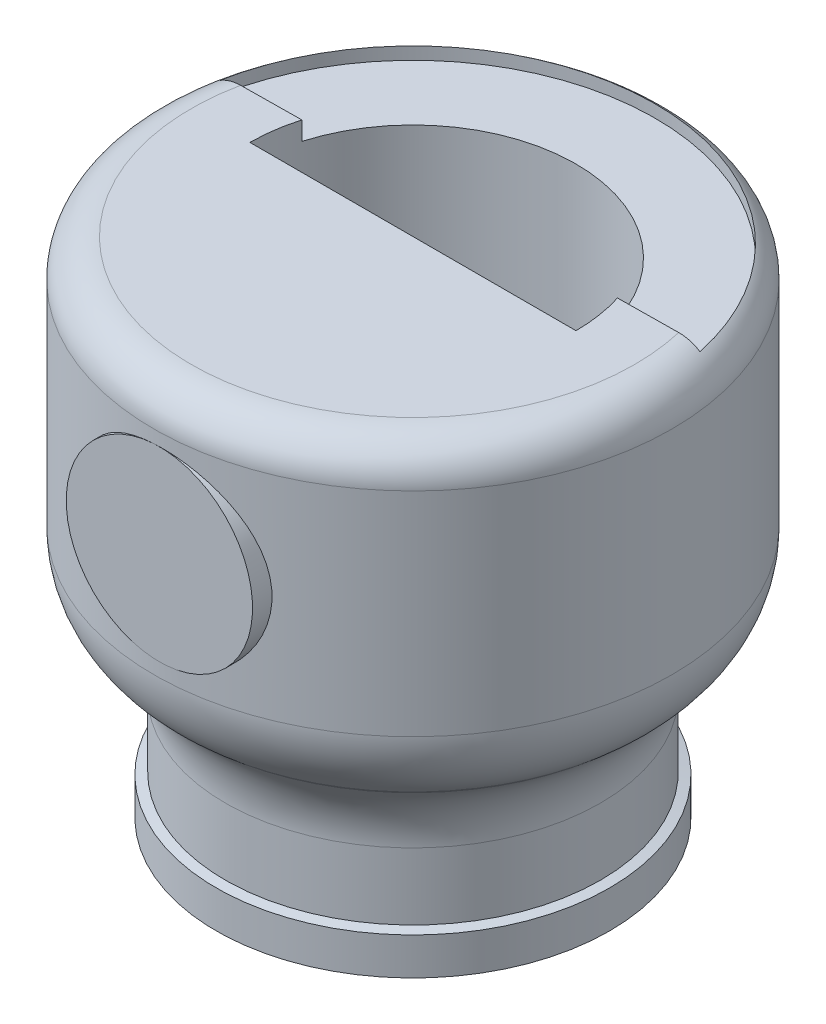
ISO-10303-21;
HEADER;
FILE_DESCRIPTION(('STEP AP214'),'2;1');
FILE_NAME('part.step','',(''),(''),'','','');
FILE_SCHEMA(('AUTOMOTIVE_DESIGN { 1 0 10303 214 1 1 1 1 }'));
ENDSEC;
DATA;
#1=APPLICATION_CONTEXT('core data for automotive mechanical design processes');
#2=APPLICATION_PROTOCOL_DEFINITION('international standard','automotive_design',2000,#1);
#3=PRODUCT_CONTEXT('',#1,'mechanical');
#4=PRODUCT('Part','Part','',(#3));
#5=PRODUCT_RELATED_PRODUCT_CATEGORY('part','',(#4));
#6=PRODUCT_DEFINITION_FORMATION('','',#4);
#7=PRODUCT_DEFINITION_CONTEXT('part definition',#1,'design');
#8=PRODUCT_DEFINITION('design','',#6,#7);
#9=PRODUCT_DEFINITION_SHAPE('','',#8);
#10=(LENGTH_UNIT() NAMED_UNIT(*) SI_UNIT(.MILLI.,.METRE.));
#11=(NAMED_UNIT(*) PLANE_ANGLE_UNIT() SI_UNIT($,.RADIAN.));
#12=(NAMED_UNIT(*) SI_UNIT($,.STERADIAN.) SOLID_ANGLE_UNIT());
#13=UNCERTAINTY_MEASURE_WITH_UNIT(LENGTH_MEASURE(1.E-05),#10,'distance_accuracy_value','');
#14=(GEOMETRIC_REPRESENTATION_CONTEXT(3) GLOBAL_UNCERTAINTY_ASSIGNED_CONTEXT((#13)) GLOBAL_UNIT_ASSIGNED_CONTEXT((#10,
#11,#12)) REPRESENTATION_CONTEXT('',''));
#15=CARTESIAN_POINT('',(0.,0.,0.));
#16=DIRECTION('',(0.,0.,1.));
#17=DIRECTION('',(1.,0.,0.));
#18=AXIS2_PLACEMENT_3D('',#15,#16,#17);
#19=CARTESIAN_POINT('',(26.5604444311898,54.,0.));
#20=DIRECTION('',(0.,1.,0.));
#21=DIRECTION('',(-1.,0.,0.));
#22=AXIS2_PLACEMENT_3D('',#19,#20,#21);
#23=PLANE('',#22);
#24=DIRECTION('',(0.999935016307761,0.,-0.0114001386657162));
#25=VECTOR('',#24,1.);
#26=CARTESIAN_POINT('',(-22.7912773460258,54.,-4.78341249034732));
#27=LINE('',#26,#25);
#28=CARTESIAN_POINT('',(-20.5395896929195,54.,-4.80908371003526));
#29=VERTEX_POINT('',#28);
#30=CARTESIAN_POINT('',(-14.0399802990221,54.,-4.8831849737724));
#31=VERTEX_POINT('',#30);
#32=EDGE_CURVE('E121',#29,#31,#27,.T.);
#33=ORIENTED_EDGE('',*,*,#32,.F.);
#34=CARTESIAN_POINT('',(2.76491495539482,54.,0.));
#35=DIRECTION('',(0.,-1.,0.));
#36=DIRECTION('',(1.,0.,0.));
#37=AXIS2_PLACEMENT_3D('',#34,#35,#36);
#38=CIRCLE('',#37,23.795529475795);
#39=CARTESIAN_POINT('',(25.9537208325637,54.,-5.33914834261092));
#40=VERTEX_POINT('',#39);
#41=EDGE_CURVE('E239',#40,#29,#38,.T.);
#42=ORIENTED_EDGE('',*,*,#41,.F.);
#43=CARTESIAN_POINT('',(19.4541114386663,54.,-5.26504707887378));
#44=VERTEX_POINT('',#43);
#45=EDGE_CURVE('E128',#44,#40,#27,.T.);
#46=ORIENTED_EDGE('',*,*,#45,.F.);
#47=CARTESIAN_POINT('',(2.76491495539482,54.,0.));
#48=DIRECTION('',(0.,1.,0.));
#49=DIRECTION('',(-1.,0.,0.));
#50=AXIS2_PLACEMENT_3D('',#47,#48,#49);
#51=CIRCLE('',#50,17.5);
#52=CARTESIAN_POINT('',(20.2649149553948,54.,0.));
#53=VERTEX_POINT('',#52);
#54=EDGE_CURVE('E286',#44,#53,#51,.F.);
#55=ORIENTED_EDGE('',*,*,#54,.T.);
#56=DIRECTION('',(-1.,0.,0.));
#57=VECTOR('',#56,1.);
#58=CARTESIAN_POINT('',(26.5604444311898,54.,0.));
#59=LINE('',#58,#57);
#60=CARTESIAN_POINT('',(-14.7350850446052,54.,0.));
#61=VERTEX_POINT('',#60);
#62=EDGE_CURVE('E287',#53,#61,#59,.T.);
#63=ORIENTED_EDGE('',*,*,#62,.T.);
#64=EDGE_CURVE('E241',#61,#31,#51,.F.);
#65=ORIENTED_EDGE('',*,*,#64,.T.);
#66=EDGE_LOOP('',(#33,#42,#46,#55,#63,#65));
#67=FACE_BOUND('',#66,.T.);
#68=ADVANCED_FACE('F36',(#67),#23,.T.);
#69=CARTESIAN_POINT('',(19.9,15.,0.));
#70=DIRECTION('',(0.,-1.,0.));
#71=DIRECTION('',(1.,0.,0.));
#72=AXIS2_PLACEMENT_3D('',#69,#70,#71);
#73=PLANE('',#72);
#74=CARTESIAN_POINT('',(2.76491495539483,15.,0.));
#75=DIRECTION('',(0.,-1.,0.));
#76=DIRECTION('',(1.,0.,0.));
#77=AXIS2_PLACEMENT_3D('',#74,#75,#76);
#78=CIRCLE('',#77,17.1350850446052);
#79=CARTESIAN_POINT('',(19.9,15.,0.));
#80=VERTEX_POINT('',#79);
#81=CARTESIAN_POINT('',(-14.3701700892103,15.,0.));
#82=VERTEX_POINT('',#81);
#83=EDGE_CURVE('E246',#80,#82,#78,.T.);
#84=ORIENTED_EDGE('',*,*,#83,.T.);
#85=DIRECTION('',(1.,0.,0.));
#86=VECTOR('',#85,1.);
#87=CARTESIAN_POINT('',(19.9,15.,0.));
#88=LINE('',#87,#86);
#89=EDGE_CURVE('E289',#82,#80,#88,.T.);
#90=ORIENTED_EDGE('',*,*,#89,.T.);
#91=EDGE_LOOP('',(#84,#90));
#92=FACE_BOUND('',#91,.T.);
#93=ADVANCED_FACE('F228',(#92),#73,.T.);
#94=CARTESIAN_POINT('',(2.76491495539483,14.,0.));
#95=DIRECTION('',(0.,-1.,0.));
#96=DIRECTION('',(1.,0.,0.));
#97=AXIS2_PLACEMENT_3D('',#94,#95,#96);
#98=TOROIDAL_SURFACE('',#97,17.1350850446052,1.);
#99=CARTESIAN_POINT('',(2.76491495539483,14.,0.));
#100=DIRECTION('',(0.,-1.,0.));
#101=DIRECTION('',(1.,0.,0.));
#102=AXIS2_PLACEMENT_3D('',#99,#100,#101);
#103=CIRCLE('',#102,18.1350850446052);
#104=CARTESIAN_POINT('',(20.9,14.,0.));
#105=VERTEX_POINT('',#104);
#106=EDGE_CURVE('E252',#105,#105,#103,.T.);
#107=ORIENTED_EDGE('',*,*,#106,.T.);
#108=EDGE_LOOP('',(#107));
#109=FACE_BOUND('',#108,.T.);
#110=ORIENTED_EDGE('',*,*,#83,.F.);
#111=CARTESIAN_POINT('',(19.9,14.,0.));
#112=DIRECTION('',(0.,0.,-1.));
#113=DIRECTION('',(-1.,0.,0.));
#114=AXIS2_PLACEMENT_3D('',#111,#112,#113);
#115=CIRCLE('',#114,1.);
#116=CARTESIAN_POINT('',(20.2649149553948,14.9310408558861,0.));
#117=VERTEX_POINT('',#116);
#118=EDGE_CURVE('E303',#80,#117,#115,.T.);
#119=ORIENTED_EDGE('',*,*,#118,.T.);
#120=CARTESIAN_POINT('',(2.76491495539483,14.9310408558861,0.));
#121=DIRECTION('',(0.,-1.,0.));
#122=DIRECTION('',(1.,0.,0.));
#123=AXIS2_PLACEMENT_3D('',#120,#121,#122);
#124=CIRCLE('',#123,17.5);
#125=CARTESIAN_POINT('',(-14.7350850446052,14.9310408558861,0.));
#126=VERTEX_POINT('',#125);
#127=EDGE_CURVE('E300',#117,#126,#124,.F.);
#128=ORIENTED_EDGE('',*,*,#127,.T.);
#129=CARTESIAN_POINT('',(-14.3701700892103,14.,0.));
#130=DIRECTION('',(0.,0.,-1.));
#131=DIRECTION('',(-1.,0.,0.));
#132=AXIS2_PLACEMENT_3D('',#129,#130,#131);
#133=CIRCLE('',#132,1.);
#134=EDGE_CURVE('E188',#126,#82,#133,.T.);
#135=ORIENTED_EDGE('',*,*,#134,.T.);
#136=EDGE_LOOP('',(#110,#119,#128,#135));
#137=FACE_BOUND('',#136,.T.);
#138=ADVANCED_FACE('F175',(#109,#137),#98,.F.);
#139=CARTESIAN_POINT('',(2.76491495539483,7.82182165652493,0.));
#140=DIRECTION('',(0.,-1.,0.));
#141=DIRECTION('',(1.,0.,0.));
#142=AXIS2_PLACEMENT_3D('',#139,#140,#141);
#143=CYLINDRICAL_SURFACE('',#142,18.1350850446052);
#144=CARTESIAN_POINT('',(2.76491495539483,0.,0.));
#145=DIRECTION('',(0.,-1.,0.));
#146=DIRECTION('',(1.,0.,0.));
#147=AXIS2_PLACEMENT_3D('',#144,#145,#146);
#148=CIRCLE('',#147,18.1350850446052);
#149=CARTESIAN_POINT('',(20.9,0.,0.));
#150=VERTEX_POINT('',#149);
#151=EDGE_CURVE('E186',#150,#150,#148,.T.);
#152=ORIENTED_EDGE('',*,*,#151,.T.);
#153=EDGE_LOOP('',(#152));
#154=FACE_BOUND('',#153,.T.);
#155=ORIENTED_EDGE('',*,*,#106,.F.);
#156=EDGE_LOOP('',(#155));
#157=FACE_BOUND('',#156,.T.);
#158=ADVANCED_FACE('F38',(#154,#157),#143,.F.);
#159=CARTESIAN_POINT('',(20.9,0.,0.));
#160=DIRECTION('',(0.,-1.,0.));
#161=DIRECTION('',(1.,0.,0.));
#162=AXIS2_PLACEMENT_3D('',#159,#160,#161);
#163=PLANE('',#162);
#164=CARTESIAN_POINT('',(2.76491495539483,0.,0.));
#165=DIRECTION('',(0.,-1.,0.));
#166=DIRECTION('',(1.,0.,0.));
#167=AXIS2_PLACEMENT_3D('',#164,#165,#166);
#168=CIRCLE('',#167,21.1066768821093);
#169=CARTESIAN_POINT('',(23.8715918375041,0.,0.));
#170=VERTEX_POINT('',#169);
#171=EDGE_CURVE('E272',#170,#170,#168,.T.);
#172=ORIENTED_EDGE('',*,*,#171,.T.);
#173=EDGE_LOOP('',(#172));
#174=FACE_BOUND('',#173,.T.);
#175=ORIENTED_EDGE('',*,*,#151,.F.);
#176=EDGE_LOOP('',(#175));
#177=FACE_BOUND('',#176,.T.);
#178=ADVANCED_FACE('F217',(#174,#177),#163,.T.);
#179=CARTESIAN_POINT('',(2.76491495539483,7.82182165652493,0.));
#180=DIRECTION('',(0.,-1.,0.));
#181=DIRECTION('',(1.,0.,0.));
#182=AXIS2_PLACEMENT_3D('',#179,#180,#181);
#183=CYLINDRICAL_SURFACE('',#182,21.1066768821093);
#184=CARTESIAN_POINT('',(2.76491495539483,4.,0.));
#185=DIRECTION('',(0.,-1.,0.));
#186=DIRECTION('',(1.,0.,0.));
#187=AXIS2_PLACEMENT_3D('',#184,#185,#186);
#188=CIRCLE('',#187,21.1066768821093);
#189=CARTESIAN_POINT('',(23.8715918375041,4.,0.));
#190=VERTEX_POINT('',#189);
#191=EDGE_CURVE('E270',#190,#190,#188,.T.);
#192=ORIENTED_EDGE('',*,*,#191,.T.);
#193=EDGE_LOOP('',(#192));
#194=FACE_BOUND('',#193,.T.);
#195=ORIENTED_EDGE('',*,*,#171,.F.);
#196=EDGE_LOOP('',(#195));
#197=FACE_BOUND('',#196,.T.);
#198=ADVANCED_FACE('F214',(#194,#197),#183,.T.);
#199=CARTESIAN_POINT('',(2.76491495539483,4.,0.));
#200=DIRECTION('',(0.,-1.,0.));
#201=DIRECTION('',(1.,0.,0.));
#202=AXIS2_PLACEMENT_3D('',#199,#200,#201);
#203=CONICAL_SURFACE('',#202,21.1066768821093,1.33186665186768);
#204=CARTESIAN_POINT('',(2.76491495539483,4.23666284308145,0.));
#205=DIRECTION('',(0.,-1.,0.));
#206=DIRECTION('',(1.,0.,0.));
#207=AXIS2_PLACEMENT_3D('',#204,#205,#206);
#208=CIRCLE('',#207,20.1350850446052);
#209=CARTESIAN_POINT('',(22.9,4.23666284308145,0.));
#210=VERTEX_POINT('',#209);
#211=EDGE_CURVE('E267',#210,#210,#208,.T.);
#212=ORIENTED_EDGE('',*,*,#211,.T.);
#213=EDGE_LOOP('',(#212));
#214=FACE_BOUND('',#213,.T.);
#215=ORIENTED_EDGE('',*,*,#191,.F.);
#216=EDGE_LOOP('',(#215));
#217=FACE_BOUND('',#216,.T.);
#218=ADVANCED_FACE('F210',(#214,#217),#203,.T.);
#219=CARTESIAN_POINT('',(2.76491495539483,7.82182165652493,0.));
#220=DIRECTION('',(0.,-1.,0.));
#221=DIRECTION('',(1.,0.,0.));
#222=AXIS2_PLACEMENT_3D('',#219,#220,#221);
#223=CYLINDRICAL_SURFACE('',#222,20.1350850446052);
#224=CARTESIAN_POINT('',(2.76491495539483,11.4043081021399,0.));
#225=DIRECTION('',(0.,-1.,0.));
#226=DIRECTION('',(1.,0.,0.));
#227=AXIS2_PLACEMENT_3D('',#224,#225,#226);
#228=CIRCLE('',#227,20.1350850446052);
#229=CARTESIAN_POINT('',(22.9,11.4043081021399,0.));
#230=VERTEX_POINT('',#229);
#231=EDGE_CURVE('E264',#230,#230,#228,.T.);
#232=ORIENTED_EDGE('',*,*,#231,.T.);
#233=EDGE_LOOP('',(#232));
#234=FACE_BOUND('',#233,.T.);
#235=ORIENTED_EDGE('',*,*,#211,.F.);
#236=EDGE_LOOP('',(#235));
#237=FACE_BOUND('',#236,.T.);
#238=ADVANCED_FACE('F206',(#234,#237),#223,.T.);
#239=CARTESIAN_POINT('',(2.76491495539483,11.40430810214,0.));
#240=DIRECTION('',(0.,-1.,0.));
#241=DIRECTION('',(1.,0.,0.));
#242=AXIS2_PLACEMENT_3D('',#239,#240,#241);
#243=TOROIDAL_SURFACE('',#242,30.1350850446052,10.);
#244=CARTESIAN_POINT('',(2.76491495539483,19.0647525333298,0.));
#245=DIRECTION('',(0.,-1.,0.));
#246=DIRECTION('',(1.,0.,0.));
#247=AXIS2_PLACEMENT_3D('',#244,#245,#246);
#248=CIRCLE('',#247,23.7072089477399);
#249=CARTESIAN_POINT('',(26.4721239031347,19.0647525333298,0.));
#250=VERTEX_POINT('',#249);
#251=EDGE_CURVE('E261',#250,#250,#248,.T.);
#252=ORIENTED_EDGE('',*,*,#251,.T.);
#253=EDGE_LOOP('',(#252));
#254=FACE_BOUND('',#253,.T.);
#255=ORIENTED_EDGE('',*,*,#231,.F.);
#256=EDGE_LOOP('',(#255));
#257=FACE_BOUND('',#256,.T.);
#258=ADVANCED_FACE('F202',(#254,#257),#243,.F.);
#259=CARTESIAN_POINT('',(2.76491495539483,19.0647525333298,0.));
#260=DIRECTION('',(0.,1.,0.));
#261=DIRECTION('',(-1.,0.,0.));
#262=AXIS2_PLACEMENT_3D('',#259,#260,#261);
#263=CONICAL_SURFACE('',#262,23.7072089477399,0.872664625997171);
#264=CARTESIAN_POINT('',(2.76491495539483,19.4978929309155,0.));
#265=DIRECTION('',(0.,-1.,0.));
#266=DIRECTION('',(1.,0.,0.));
#267=AXIS2_PLACEMENT_3D('',#264,#265,#266);
#268=CIRCLE('',#267,24.2234055726603);
#269=CARTESIAN_POINT('',(26.9883205280551,19.4978929309155,0.));
#270=VERTEX_POINT('',#269);
#271=EDGE_CURVE('E258',#270,#270,#268,.T.);
#272=ORIENTED_EDGE('',*,*,#271,.T.);
#273=EDGE_LOOP('',(#272));
#274=FACE_BOUND('',#273,.T.);
#275=ORIENTED_EDGE('',*,*,#251,.F.);
#276=EDGE_LOOP('',(#275));
#277=FACE_BOUND('',#276,.T.);
#278=ADVANCED_FACE('F198',(#274,#277),#263,.T.);
#279=CARTESIAN_POINT('',(2.76491495539483,27.1583373621054,0.));
#280=DIRECTION('',(0.,-1.,0.));
#281=DIRECTION('',(1.,0.,0.));
#282=AXIS2_PLACEMENT_3D('',#279,#280,#281);
#283=TOROIDAL_SURFACE('',#282,17.795529475795,10.);
#284=CARTESIAN_POINT('',(2.76491495539483,27.1583373621054,0.));
#285=DIRECTION('',(0.,-1.,0.));
#286=DIRECTION('',(1.,0.,0.));
#287=AXIS2_PLACEMENT_3D('',#284,#285,#286);
#288=CIRCLE('',#287,27.795529475795);
#289=CARTESIAN_POINT('',(30.5604444311898,27.1583373621054,0.));
#290=VERTEX_POINT('',#289);
#291=EDGE_CURVE('E249',#290,#290,#288,.T.);
#292=ORIENTED_EDGE('',*,*,#291,.T.);
#293=EDGE_LOOP('',(#292));
#294=FACE_BOUND('',#293,.T.);
#295=ORIENTED_EDGE('',*,*,#271,.F.);
#296=EDGE_LOOP('',(#295));
#297=FACE_BOUND('',#296,.T.);
#298=ADVANCED_FACE('F194',(#294,#297),#283,.T.);
#299=CARTESIAN_POINT('',(2.76491495539483,7.82182165652493,0.));
#300=DIRECTION('',(0.,-1.,0.));
#301=DIRECTION('',(1.,0.,0.));
#302=AXIS2_PLACEMENT_3D('',#299,#300,#301);
#303=CYLINDRICAL_SURFACE('',#302,27.795529475795);
#304=CARTESIAN_POINT('',(13.3463458867871,38.6583373621054,25.7026220118486));
#305=CARTESIAN_POINT('',(13.3463467506797,38.9277821022739,25.7026212426184));
#306=CARTESIAN_POINT('',(13.3354465811937,39.1972148635378,25.7071171137235));
#307=CARTESIAN_POINT('',(13.2919687629021,39.7340174371551,25.7249519118154));
#308=CARTESIAN_POINT('',(13.2593923457373,40.0013873658451,25.7382903363697));
#309=CARTESIAN_POINT('',(13.1729081194495,40.5320945802206,25.7733836810905));
#310=CARTESIAN_POINT('',(13.1189995294657,40.79543171792,25.7951389093522));
#311=CARTESIAN_POINT('',(12.9903943982892,41.3162067659098,25.8463887620421));
#312=CARTESIAN_POINT('',(12.9156973821031,41.5736445412607,25.8758835633105));
#313=CARTESIAN_POINT('',(12.7464464105734,42.0802133582729,25.9416402412638));
#314=CARTESIAN_POINT('',(12.651947157288,42.329365136829,25.9778834459237));
#315=CARTESIAN_POINT('',(12.44373220242,42.8186599126973,26.0561762717797));
#316=CARTESIAN_POINT('',(12.330009340582,43.0587995123479,26.0982280554375));
#317=CARTESIAN_POINT('',(12.0842401425005,43.528602925991,26.1869948362899));
#318=CARTESIAN_POINT('',(11.9521936997097,43.7582666790585,26.2337098605997));
#319=CARTESIAN_POINT('',(11.6706780123648,44.2058963523142,26.3306095370754));
#320=CARTESIAN_POINT('',(11.5212074978844,44.4238614181689,26.3807944420297));
#321=CARTESIAN_POINT('',(11.1985025620434,44.8567103541455,26.4857726252769));
#322=CARTESIAN_POINT('',(11.0244902858668,45.0709889713522,26.5406716961283));
#323=CARTESIAN_POINT('',(10.6595087786535,45.4842923905928,26.6515143306982));
#324=CARTESIAN_POINT('',(10.4685391398865,45.683316825634,26.7074579195059));
#325=CARTESIAN_POINT('',(10.0707167754452,46.0650127403382,26.8190118536809));
#326=CARTESIAN_POINT('',(9.86386023069171,46.2476802649348,26.8746221154337));
#327=CARTESIAN_POINT('',(9.43549130510837,46.5954921209992,26.9841386350754));
#328=CARTESIAN_POINT('',(9.21397928881647,46.7606368880596,27.038044935299));
#329=CARTESIAN_POINT('',(8.74863878036111,47.0784128766494,27.1449016086897));
#330=CARTESIAN_POINT('',(8.50427674096215,47.2303042566693,27.1977325815785));
#331=CARTESIAN_POINT('',(8.00273380579803,47.5127627227737,27.2987566692341));
#332=CARTESIAN_POINT('',(7.74555800532649,47.6433381980195,27.3469516054933));
#333=CARTESIAN_POINT('',(7.2200167476639,47.8821093354802,27.4374672990011));
#334=CARTESIAN_POINT('',(6.95165142646173,47.9903052695837,27.4797881276121));
#335=CARTESIAN_POINT('',(6.40564839316566,48.1832779921821,27.5574406379041));
#336=CARTESIAN_POINT('',(6.12801115886875,48.2680559853613,27.5927726790812));
#337=CARTESIAN_POINT('',(5.57638215157694,48.4105135832943,27.6543152072922));
#338=CARTESIAN_POINT('',(5.30266011964647,48.4691091447917,27.6808239838258));
#339=CARTESIAN_POINT('',(4.75062513289938,48.5632043331973,27.7258920994341));
#340=CARTESIAN_POINT('',(4.4723122799301,48.5987044717727,27.7444516146174));
#341=CARTESIAN_POINT('',(3.91333763495258,48.6461887564039,27.7732043831257));
#342=CARTESIAN_POINT('',(3.6326765478635,48.6581797221137,27.7834000621734));
#343=CARTESIAN_POINT('',(3.07116470286908,48.6584918943381,27.7952607055486));
#344=CARTESIAN_POINT('',(2.79031395171638,48.6468139032719,27.7969259590657));
#345=CARTESIAN_POINT('',(2.24491810603403,48.6010682628443,27.7919345123894));
#346=CARTESIAN_POINT('',(1.9802701976664,48.5681695673053,27.7856967619089));
#347=CARTESIAN_POINT('',(1.45472369944559,48.4814067313321,27.7658783501912));
#348=CARTESIAN_POINT('',(1.19382496243998,48.4275434160882,27.7522979779594));
#349=CARTESIAN_POINT('',(0.677577935562517,48.2993135221171,27.7182504886453));
#350=CARTESIAN_POINT('',(0.422229730170447,48.2249466315582,27.6977832668222));
#351=CARTESIAN_POINT('',(-0.0812182002820311,48.0563308589155,27.6505861686878));
#352=CARTESIAN_POINT('',(-0.329317769825685,47.9620815506179,27.6238561581216));
#353=CARTESIAN_POINT('',(-0.818471743992125,47.753692525213,27.5646864705793));
#354=CARTESIAN_POINT('',(-1.05946155178538,47.6394127245774,27.5322065644623));
#355=CARTESIAN_POINT('',(-1.53110602263131,47.3922583555493,27.4625657330638));
#356=CARTESIAN_POINT('',(-1.76175692596454,47.2593770940488,27.4254031233522));
#357=CARTESIAN_POINT('',(-2.21130548967729,46.9759762894753,27.3474083145757));
#358=CARTESIAN_POINT('',(-2.43020277787631,46.8254561883447,27.3065759994182));
#359=CARTESIAN_POINT('',(-2.85503064445834,46.5077508697439,27.2223176301386));
#360=CARTESIAN_POINT('',(-3.06096039890063,46.340564595066,27.1788914115441));
#361=CARTESIAN_POINT('',(-3.46888943397179,45.9815950003482,27.0883184701548));
#362=CARTESIAN_POINT('',(-3.670150520127,45.7889914436546,27.0410950137027));
#363=CARTESIAN_POINT('',(-4.05588736727981,45.3877061868811,26.9463832037301));
#364=CARTESIAN_POINT('',(-4.24036262263078,45.1790240028073,26.8988948422756));
#365=CARTESIAN_POINT('',(-4.5914220414673,44.7467994372934,26.8050143466062));
#366=CARTESIAN_POINT('',(-4.75800206361397,44.5232536353894,26.7586224680701));
#367=CARTESIAN_POINT('',(-5.07212087537345,44.0626976394474,26.6683153425431));
#368=CARTESIAN_POINT('',(-5.2196603768811,43.8256879492801,26.6244000029929));
#369=CARTESIAN_POINT('',(-5.49772859126478,43.3342142456592,26.5394385045658));
#370=CARTESIAN_POINT('',(-5.62780461077978,43.0794788683478,26.4984781635685));
#371=CARTESIAN_POINT('',(-5.86586399421236,42.559232637673,26.4218991371288));
#372=CARTESIAN_POINT('',(-5.97385638830328,42.2937262421033,26.3862782699295));
#373=CARTESIAN_POINT('',(-6.1668392723074,41.7537372736574,26.3215803603233));
#374=CARTESIAN_POINT('',(-6.2518328039325,41.4792558931539,26.2925024526638));
#375=CARTESIAN_POINT('',(-6.39800337069516,40.9233418126132,26.2419203231456));
#376=CARTESIAN_POINT('',(-6.45918167304372,40.6419094832844,26.2204156983175));
#377=CARTESIAN_POINT('',(-6.55494105559617,40.0867471613471,26.1865271745711));
#378=CARTESIAN_POINT('',(-6.59056927192223,39.8132193541774,26.1737851983376));
#379=CARTESIAN_POINT('',(-6.63910912568212,39.2639004168782,26.1563847172211));
#380=CARTESIAN_POINT('',(-6.6520214135389,38.9881093517795,26.1517259808916));
#381=CARTESIAN_POINT('',(-6.65499588625463,38.436440217703,26.1506546773984));
#382=CARTESIAN_POINT('',(-6.64506227006915,38.1605621740297,26.1542405949113));
#383=CARTESIAN_POINT('',(-6.60245672026117,37.6107987661365,26.1695303281976));
#384=CARTESIAN_POINT('',(-6.56978514634915,37.3369133704626,26.1812340155494));
#385=CARTESIAN_POINT('',(-6.48373595936502,36.8037277442479,26.2117512471871));
#386=CARTESIAN_POINT('',(-6.43120768216105,36.5442730018554,26.2302724288113));
#387=CARTESIAN_POINT('',(-6.30589572281171,36.0307712719075,26.2738700992557));
#388=CARTESIAN_POINT('',(-6.23310488253185,35.7767262296359,26.2989489044905));
#389=CARTESIAN_POINT('',(-6.06790705793705,35.2758269101046,26.3548915465073));
#390=CARTESIAN_POINT('',(-5.97550466195667,35.0289709662142,26.3857540299383));
#391=CARTESIAN_POINT('',(-5.77175338960273,34.5437867607262,26.4523767744537));
#392=CARTESIAN_POINT('',(-5.66039717760229,34.3054618442483,26.4881389307914));
#393=CARTESIAN_POINT('',(-5.41581964512394,33.831564001845,26.564712662015));
#394=CARTESIAN_POINT('',(-5.28202751992324,33.5963054174963,26.605646401383));
#395=CARTESIAN_POINT('',(-4.99603821175475,33.1376763735824,26.6904723195448));
#396=CARTESIAN_POINT('',(-4.84383279563464,32.9143112967348,26.734365817827));
#397=CARTESIAN_POINT('',(-4.52202772496277,32.4808325603602,26.8238664339569));
#398=CARTESIAN_POINT('',(-4.35242713478869,32.270719614599,26.8694736438951));
#399=CARTESIAN_POINT('',(-3.99685318796656,31.864943181332,26.9611508600873));
#400=CARTESIAN_POINT('',(-3.81087945517322,31.6692800259756,27.007220876952));
#401=CARTESIAN_POINT('',(-3.41386155361355,31.2840646941256,27.1008825380269));
#402=CARTESIAN_POINT('',(-3.20202640665692,31.0953168380638,27.1484339302512));
#403=CARTESIAN_POINT('',(-2.76286436248656,30.7363456425542,27.2412455306916));
#404=CARTESIAN_POINT('',(-2.53554312242131,30.5661155968439,27.2865065651682));
#405=CARTESIAN_POINT('',(-2.06667271203996,30.2452550666619,27.3734191976298));
#406=CARTESIAN_POINT('',(-1.82511812373015,30.0946321166597,27.4150694060318));
#407=CARTESIAN_POINT('',(-1.32953585786986,29.8142919890175,27.4934506514793));
#408=CARTESIAN_POINT('',(-1.07551358642064,29.6845658530069,27.5301837953007));
#409=CARTESIAN_POINT('',(-0.558963445896263,29.4480975901194,27.5972916324096));
#410=CARTESIAN_POINT('',(-0.296532196118554,29.3411599161002,27.6277203553277));
#411=CARTESIAN_POINT('',(0.237105421191776,29.1497639570286,27.681646347434));
#412=CARTESIAN_POINT('',(0.508311784862325,29.0653056620829,27.7051436196728));
#413=CARTESIAN_POINT('',(1.05736622775294,28.9196922101092,27.7443950186722));
#414=CARTESIAN_POINT('',(1.33521203382265,28.8585291955788,27.760151756837));
#415=CARTESIAN_POINT('',(1.89543988383297,28.7600674488549,27.7833412546476));
#416=CARTESIAN_POINT('',(2.17782171303057,28.7227675903324,27.7907744071749));
#417=CARTESIAN_POINT('',(2.73014021528458,28.6736923897316,27.7968081006747));
#418=CARTESIAN_POINT('',(2.99996433279007,28.6606955856305,27.7958459939314));
#419=CARTESIAN_POINT('',(3.53963003763627,28.6565651175248,27.7860414433971));
#420=CARTESIAN_POINT('',(3.8094716239489,28.6654306374236,27.7771992937672));
#421=CARTESIAN_POINT('',(4.34716757247668,28.7048945975942,27.7517634945061));
#422=CARTESIAN_POINT('',(4.61502208219522,28.7354914080766,27.7351704262052));
#423=CARTESIAN_POINT('',(5.14683840460148,28.8180812466258,27.6945666520365));
#424=CARTESIAN_POINT('',(5.41080019683061,28.870074387102,27.6705559071988));
#425=CARTESIAN_POINT('',(5.92904610024611,28.9939919992937,27.6160569422403));
#426=CARTESIAN_POINT('',(6.18341619783529,29.0656031552389,27.5856721734139));
#427=CARTESIAN_POINT('',(6.68506895537541,29.2284645935136,27.5188646144497));
#428=CARTESIAN_POINT('',(6.93234905101865,29.3197218823934,27.4824396712259));
#429=CARTESIAN_POINT('',(7.41818360014348,29.5210909377065,27.4043623721521));
#430=CARTESIAN_POINT('',(7.65673988387677,29.6311987214527,27.3627111209994));
#431=CARTESIAN_POINT('',(8.12391548923101,29.869502337868,27.2750634742108));
#432=CARTESIAN_POINT('',(8.35253092803971,29.9977051567529,27.2290654026116));
#433=CARTESIAN_POINT('',(8.80852283960875,30.2774457183902,27.1315873881407));
#434=CARTESIAN_POINT('',(9.03538233947552,30.4297729865935,27.079954013771));
#435=CARTESIAN_POINT('',(9.47561863541725,30.7522319968814,26.9742320700564));
#436=CARTESIAN_POINT('',(9.68898924827505,30.9223718105583,26.9201423940019));
#437=CARTESIAN_POINT('',(10.1009819192527,31.2793675026282,26.8108003364131));
#438=CARTESIAN_POINT('',(10.2996021560979,31.4662254390003,26.7555478123759));
#439=CARTESIAN_POINT('',(10.6809508336662,31.8555565786895,26.6452105314894));
#440=CARTESIAN_POINT('',(10.8636790200245,32.0580300318472,26.5901257773391));
#441=CARTESIAN_POINT('',(11.2206302863772,32.4876508411687,26.4788399761401));
#442=CARTESIAN_POINT('',(11.394011161067,32.7155185914245,26.4227143435104));
#443=CARTESIAN_POINT('',(11.7208572308537,33.1857229334844,26.3137271080731));
#444=CARTESIAN_POINT('',(11.8743299975217,33.4280539730205,26.2608642683739));
#445=CARTESIAN_POINT('',(12.1603208389707,33.9258673231902,26.1599086931028));
#446=CARTESIAN_POINT('',(12.2928309519575,34.1813545820673,26.1118177725189));
#447=CARTESIAN_POINT('',(12.5356343745004,34.7036110828207,26.0219381487292));
#448=CARTESIAN_POINT('',(12.6459377702971,34.9703751358822,25.9801465865465));
#449=CARTESIAN_POINT('',(12.8433877754872,35.5135432745424,25.9041898684053));
#450=CARTESIAN_POINT('',(12.9305241387967,35.789951564566,25.8700280879356));
#451=CARTESIAN_POINT('',(13.0806448742074,36.3501956411642,25.8105348341637));
#452=CARTESIAN_POINT('',(13.143629103182,36.6340314717442,25.7852034131907));
#453=CARTESIAN_POINT('',(13.2446847730938,37.2066584983713,25.7442976712579));
#454=CARTESIAN_POINT('',(13.2827686278462,37.4954471514337,25.7287184885891));
#455=CARTESIAN_POINT('',(13.3335977957686,38.0756077855596,25.7078814502822));
#456=CARTESIAN_POINT('',(13.346344952637,38.3669795771037,25.7026228436376));
#457=CARTESIAN_POINT('',(13.3463458867871,38.6583373621054,25.7026220118486));
#458=B_SPLINE_CURVE_WITH_KNOTS('',3,(#304,#305,#306,#307,#308,#309,#310,#311,#312,#313,#314,
#315,#316,#317,#318,#319,#320,#321,#322,#323,#324,#325,#326,#327,#328,#329,#330,#331,#332,#333,
#334,#335,#336,#337,#338,#339,#340,#341,#342,#343,#344,#345,#346,#347,#348,#349,#350,#351,#352,
#353,#354,#355,#356,#357,#358,#359,#360,#361,#362,#363,#364,#365,#366,#367,#368,#369,#370,#371,
#372,#373,#374,#375,#376,#377,#378,#379,#380,#381,#382,#383,#384,#385,#386,#387,#388,#389,#390,
#391,#392,#393,#394,#395,#396,#397,#398,#399,#400,#401,#402,#403,#404,#405,#406,#407,#408,#409,
#410,#411,#412,#413,#414,#415,#416,#417,#418,#419,#420,#421,#422,#423,#424,#425,#426,#427,#428,
#429,#430,#431,#432,#433,#434,#435,#436,#437,#438,#439,#440,#441,#442,#443,#444,#445,#446,#447,
#448,#449,#450,#451,#452,#453,#454,#455,#456,#457),.UNSPECIFIED.,.T.,.F.,(4,2,2,2,2,2,2,2,2,2,2,
2,2,2,2,2,2,2,2,2,2,2,2,2,2,2,2,2,2,2,2,2,2,2,2,2,2,2,2,2,2,2,2,2,2,2,2,2,2,2,2,2,2,2,2,2,2,2,2,
2,2,2,2,2,2,2,2,2,2,2,2,2,2,2,2,2,4),(0.,0.808057267816626,1.61606862586876,2.42410956378593,
3.23216896609579,4.03802492206399,4.84418170086265,5.65034316747197,6.45656342668973,
7.29995003129204,8.14335692014369,8.98696719539949,9.83055649470299,10.7070666362457,
11.5832309794046,12.4593846774343,13.3354932952741,14.1779427925391,15.0203736251361,
15.8625600451619,16.7047179140628,17.5040433523017,18.3033373313968,19.1026434673403,
19.9019667395222,20.7071210172973,21.5125657509117,22.318035974067,23.1235573242502,
23.9702286044995,24.8169253809448,25.6638176808941,26.5106783077056,27.3764233110585,
28.2418135932405,29.1070893673299,29.972319093704,30.7996703059205,31.6269978282852,
32.4541733044068,33.2813356950554,34.0765196457537,34.8719848675378,35.6672641864203,
36.4628520021808,37.2831030231985,38.1037221688819,38.9243854758148,39.7450676410223,
40.6070903069241,41.4687997429028,42.3308393387977,43.1925083929845,44.0464558479673,
44.900402927119,45.7540617141408,46.6076802059269,47.4171058287024,48.2265012369672,
49.0358359491252,49.8451749133136,50.6422741257852,51.4396580861568,52.236873784605,
53.0343981220641,53.8677478695687,54.7014768899097,55.5353086827934,56.3691538193559,
57.2434367976375,58.117386282314,58.9916669076093,59.8655495362763,60.7398180165261,
61.6140916776499,62.4879291459793,63.3617030246541),.UNSPECIFIED.);
#459=CARTESIAN_POINT('',(2.76491495539483,48.6414199557745,27.795529475795));
#460=VERTEX_POINT('',#459);
#461=CARTESIAN_POINT('',(2.76491495539483,28.6752547684362,27.795529475795));
#462=VERTEX_POINT('',#461);
#463=EDGE_CURVE('E185',#460,#462,#458,.T.);
#464=ORIENTED_EDGE('',*,*,#463,.F.);
#465=EDGE_CURVE('E178',#462,#460,#458,.T.);
#466=ORIENTED_EDGE('',*,*,#465,.F.);
#467=EDGE_LOOP('',(#464,#466));
#468=FACE_BOUND('',#467,.T.);
#469=CARTESIAN_POINT('',(2.76491495539482,50.,0.));
#470=DIRECTION('',(0.,-1.,0.));
#471=DIRECTION('',(1.,0.,0.));
#472=AXIS2_PLACEMENT_3D('',#469,#470,#471);
#473=CIRCLE('',#472,27.795529475795);
#474=CARTESIAN_POINT('',(30.5604444311898,50.,0.));
#475=VERTEX_POINT('',#474);
#476=EDGE_CURVE('E245',#475,#475,#473,.T.);
#477=ORIENTED_EDGE('',*,*,#476,.T.);
#478=EDGE_LOOP('',(#477));
#479=FACE_BOUND('',#478,.T.);
#480=ORIENTED_EDGE('',*,*,#291,.F.);
#481=EDGE_LOOP('',(#480));
#482=FACE_BOUND('',#481,.T.);
#483=ADVANCED_FACE('F190',(#468,#479,#482),#303,.T.);
#484=CARTESIAN_POINT('',(2.76491495539482,50.,0.));
#485=DIRECTION('',(0.,-1.,0.));
#486=DIRECTION('',(1.,0.,0.));
#487=AXIS2_PLACEMENT_3D('',#484,#485,#486);
#488=TOROIDAL_SURFACE('',#487,23.795529475795,4.);
#489=CARTESIAN_POINT('',(22.3359968061587,51.8998,-5.29790310678789));
#490=CARTESIAN_POINT('',(22.3916926404018,51.9997420539687,-5.29853808828481));
#491=CARTESIAN_POINT('',(22.4517210982355,52.0972542791489,-5.29922246550136));
#492=CARTESIAN_POINT('',(22.5798857140216,52.2867678498475,-5.30068365484684));
#493=CARTESIAN_POINT('',(22.6480201826351,52.3787703376389,-5.30146044771582));
#494=CARTESIAN_POINT('',(22.7917420492078,52.5565058689623,-5.30309900340344));
#495=CARTESIAN_POINT('',(22.8673167314742,52.6422491874082,-5.303960621252));
#496=CARTESIAN_POINT('',(23.0253848215984,52.807061234275,-5.30576273650615));
#497=CARTESIAN_POINT('',(23.1078784496096,52.8861297501501,-5.30670323642167));
#498=CARTESIAN_POINT('',(23.3647692000866,53.1124903773562,-5.30963201692202));
#499=CARTESIAN_POINT('',(23.5487504119628,53.2491520392823,-5.31172956455568));
#500=CARTESIAN_POINT('',(23.93658854467,53.4903261662867,-5.31615126038652));
#501=CARTESIAN_POINT('',(24.1404494108117,53.5948322326045,-5.3184754535637));
#502=CARTESIAN_POINT('',(24.5667381153854,53.7710080709714,-5.32333551973252));
#503=CARTESIAN_POINT('',(24.7894578596973,53.841971776542,-5.32587472070792));
#504=CARTESIAN_POINT('',(25.2437150103794,53.9460205807305,-5.33105365176165));
#505=CARTESIAN_POINT('',(25.4752536764918,53.9791002466621,-5.33369339620215));
#506=CARTESIAN_POINT('',(25.8255310010226,53.9997059549023,-5.33768686578365));
#507=CARTESIAN_POINT('',(25.9435900421321,54.001651608487,-5.33903284268959));
#508=CARTESIAN_POINT('',(26.1794395045254,53.9955741891725,-5.34172173399919));
#509=CARTESIAN_POINT('',(26.2972300082955,53.9875547638012,-5.34306464934327));
#510=CARTESIAN_POINT('',(26.5317363749672,53.9615702488005,-5.34573822818035));
#511=CARTESIAN_POINT('',(26.6484519162253,53.9436022748056,-5.34706888800633));
#512=CARTESIAN_POINT('',(26.8798933625548,53.8978247073897,-5.34970752405579));
#513=CARTESIAN_POINT('',(26.9946200210859,53.8700189303005,-5.35101550886938));
#514=CARTESIAN_POINT('',(27.2207893033363,53.8048686095634,-5.35359403761128));
#515=CARTESIAN_POINT('',(27.3322440964651,53.7675663203607,-5.35486472028156));
#516=CARTESIAN_POINT('',(27.5515257680453,53.6836086822103,-5.35736472420391));
#517=CARTESIAN_POINT('',(27.6593540436935,53.6369569846748,-5.35859406138525));
#518=CARTESIAN_POINT('',(27.8706946284406,53.5345519191927,-5.36100352993322));
#519=CARTESIAN_POINT('',(27.9742038324367,53.4787921400546,-5.36218362589895));
#520=CARTESIAN_POINT('',(28.1759957142716,53.3585856129801,-5.36448423083529));
#521=CARTESIAN_POINT('',(28.2742804679483,53.2941423517897,-5.36560476347227));
#522=CARTESIAN_POINT('',(28.4634660801015,53.1580260902135,-5.36776164584656));
#523=CARTESIAN_POINT('',(28.5544559617805,53.0864768202662,-5.36879901052666));
#524=CARTESIAN_POINT('',(28.729938467436,52.9358749825572,-5.37079966543449));
#525=CARTESIAN_POINT('',(28.8144337334177,52.8568254954338,-5.37176298578339));
#526=CARTESIAN_POINT('',(28.9762014349789,52.6918611715074,-5.37360727986186));
#527=CARTESIAN_POINT('',(29.0534833120172,52.605955589838,-5.37448836123236));
#528=CARTESIAN_POINT('',(29.2003122108122,52.4278296026966,-5.37616233982007));
#529=CARTESIAN_POINT('',(29.2698633863735,52.3356126318759,-5.3769552843943));
#530=CARTESIAN_POINT('',(29.373158434663,52.1855424516441,-5.37813293879661));
#531=CARTESIAN_POINT('',(29.4096521102344,52.1295624498981,-5.37854899879566));
#532=CARTESIAN_POINT('',(29.4797243010576,52.0159254533248,-5.37934788340213));
#533=CARTESIAN_POINT('',(29.5133072142616,51.9582711706313,-5.37973075815007));
#534=CARTESIAN_POINT('',(29.5454209509553,51.8998,-5.38009688299359));
#535=B_SPLINE_CURVE_WITH_KNOTS('',3,(#489,#490,#491,#492,#493,#494,#495,#496,#497,#498,#499,
#500,#501,#502,#503,#504,#505,#506,#507,#508,#509,#510,#511,#512,#513,#514,#515,#516,#517,#518,
#519,#520,#521,#522,#523,#524,#525,#526,#527,#528,#529,#530,#531,#532,#533,#534),.UNSPECIFIED.,
.F.,.F.,(4,2,2,2,2,2,2,2,2,2,2,2,2,2,2,2,2,2,2,2,2,2,4),(0.,0.343118173273998,0.686164963613906,
1.02863532510296,1.37111658777332,2.05526046987082,2.73954040436747,3.4376452064961,
4.13585010643965,4.48975066629754,4.84352172572114,5.19739540711914,5.55113196223983,
5.90332127715951,6.25537331162514,6.60767423243242,6.95983411034184,7.30668145331144,
7.65338694394133,7.99963208128635,8.34569026806784,8.54609216038964,8.74618578031398),.UNSPECIFIED.);
#536=CARTESIAN_POINT('',(28.20540848567,53.3377102492427,-5.36481956229885));
#537=VERTEX_POINT('',#536);
#538=EDGE_CURVE('E139',#40,#537,#535,.T.);
#539=ORIENTED_EDGE('',*,*,#538,.F.);
#540=ORIENTED_EDGE('',*,*,#41,.T.);
#541=CARTESIAN_POINT('',(-24.131289811311,51.8998,-4.76813516965258));
#542=CARTESIAN_POINT('',(-24.0767819813438,51.9990679295167,-4.76875660685586));
#543=CARTESIAN_POINT('',(-24.0180147886942,52.0959863708194,-4.76942660453998));
#544=CARTESIAN_POINT('',(-23.8924658339178,52.2844664629939,-4.77085797304938));
#545=CARTESIAN_POINT('',(-23.8256851576845,52.3760288371618,-4.77161933149451));
#546=CARTESIAN_POINT('',(-23.6847007045784,52.5530377165224,-4.77322667826096));
#547=CARTESIAN_POINT('',(-23.6105078369407,52.6384929013111,-4.7740725422074));
#548=CARTESIAN_POINT('',(-23.4552150155938,52.8028349172432,-4.77584301695653));
#549=CARTESIAN_POINT('',(-23.3741149944391,52.8817216842338,-4.77676762852816));
#550=CARTESIAN_POINT('',(-23.1213162453465,53.1077201665954,-4.77964975661366));
#551=CARTESIAN_POINT('',(-22.9399982233946,53.2443209670691,-4.78171694153981));
#552=CARTESIAN_POINT('',(-22.5573619510852,53.485543038086,-4.78607933158688));
#553=CARTESIAN_POINT('',(-22.3560426192657,53.5901625781684,-4.78837454903742));
#554=CARTESIAN_POINT('',(-21.9361318017259,53.7661804958536,-4.79316190168446));
#555=CARTESIAN_POINT('',(-21.7173432536456,53.8371095567203,-4.79565628356519));
#556=CARTESIAN_POINT('',(-21.2710575334206,53.9419606171194,-4.80074433330054));
#557=CARTESIAN_POINT('',(-21.0435586092491,53.9758751305464,-4.80333802112981));
#558=CARTESIAN_POINT('',(-20.5818981545769,54.0062913056676,-4.80860135636051));
#559=CARTESIAN_POINT('',(-20.3476907956204,54.0020990580351,-4.81127152624664));
#560=CARTESIAN_POINT('',(-19.8832309094732,53.9548898015719,-4.81656677745836));
#561=CARTESIAN_POINT('',(-19.6529782891844,53.9118737079693,-4.81919185984534));
#562=CARTESIAN_POINT('',(-19.2004726774905,53.7875802414712,-4.82435082181406));
#563=CARTESIAN_POINT('',(-18.9783282371937,53.7059082875029,-4.82688346381769));
#564=CARTESIAN_POINT('',(-18.5507910283702,53.5061415187391,-4.83175776403306));
#565=CARTESIAN_POINT('',(-18.3454048002876,53.3880325683719,-4.83409934767798));
#566=CARTESIAN_POINT('',(-18.0552153114751,53.1863676142004,-4.83740776308282));
#567=CARTESIAN_POINT('',(-17.9615933082784,53.1151865178076,-4.83847513626328));
#568=CARTESIAN_POINT('',(-17.7808013825567,52.9650729966276,-4.84053632322969));
#569=CARTESIAN_POINT('',(-17.6936288529175,52.8861437342895,-4.84153016673903));
#570=CARTESIAN_POINT('',(-17.5265437374295,52.7211716011882,-4.84343508401313));
#571=CARTESIAN_POINT('',(-17.446621468738,52.6351385201957,-4.84434626817081));
#572=CARTESIAN_POINT('',(-17.2945860995329,52.4564867715462,-4.84607960510047));
#573=CARTESIAN_POINT('',(-17.2224687905759,52.3638716979907,-4.84690180585242));
#574=CARTESIAN_POINT('',(-17.1124291442361,52.2090062004482,-4.84815635460463));
#575=CARTESIAN_POINT('',(-17.0719195266953,52.1485773654324,-4.8486181998743));
#576=CARTESIAN_POINT('',(-16.9943195586961,52.0256901945384,-4.84950290776153));
#577=CARTESIAN_POINT('',(-16.9572241440787,51.9632350565839,-4.84992582811496));
#578=CARTESIAN_POINT('',(-16.9218656665144,51.8998,-4.85032894585828));
#579=B_SPLINE_CURVE_WITH_KNOTS('',3,(#541,#542,#543,#544,#545,#546,#547,#548,#549,#550,#551,
#552,#553,#554,#555,#556,#557,#558,#559,#560,#561,#562,#563,#564,#565,#566,#567,#568,#569,#570,
#571,#572,#573,#574,#575,#576,#577,#578),.UNSPECIFIED.,.F.,.F.,(4,2,2,2,2,2,2,2,2,2,2,2,2,2,2,2,
2,2,4),(0.,0.339632389133599,0.679218807117585,1.01831258704191,1.3574096784618,
2.03503157754452,2.71269013530285,3.39953024434913,4.08650923947041,4.78602256419305,
5.48551939911523,6.19231564474834,6.89938643440494,7.25187349781459,7.60421728552665,
7.95608336297929,8.30775875852123,8.52591587444684,8.74374400774516),.UNSPECIFIED.);
#580=CARTESIAN_POINT('',(-22.7912773460258,53.3377102492444,-4.78341249034732));
#581=VERTEX_POINT('',#580);
#582=EDGE_CURVE('E130',#581,#29,#579,.T.);
#583=ORIENTED_EDGE('',*,*,#582,.F.);
#584=CARTESIAN_POINT('',(2.76491495539482,53.3377102492444,0.));
#585=DIRECTION('',(0.,-1.,0.));
#586=DIRECTION('',(1.,0.,0.));
#587=AXIS2_PLACEMENT_3D('',#584,#585,#586);
#588=CIRCLE('',#587,26.);
#589=EDGE_CURVE('E11',#537,#581,#588,.F.);
#590=ORIENTED_EDGE('',*,*,#589,.F.);
#591=EDGE_LOOP('',(#539,#540,#583,#590));
#592=FACE_BOUND('',#591,.T.);
#593=ORIENTED_EDGE('',*,*,#476,.F.);
#594=EDGE_LOOP('',(#593));
#595=FACE_BOUND('',#594,.T.);
#596=ADVANCED_FACE('F145',(#592,#595),#488,.T.);
#597=CARTESIAN_POINT('',(3.3463458867871,38.6583373621054,22.795529475795));
#598=DIRECTION('',(0.,0.,1.));
#599=DIRECTION('',(1.,0.,0.));
#600=AXIS2_PLACEMENT_3D('',#597,#598,#599);
#601=CYLINDRICAL_SURFACE('',#600,10.);
#602=CARTESIAN_POINT('',(3.3463458867871,38.6583373621054,27.795529475795));
#603=DIRECTION('',(0.,0.,1.));
#604=DIRECTION('',(1.,0.,0.));
#605=AXIS2_PLACEMENT_3D('',#602,#603,#604);
#606=CIRCLE('',#605,10.);
#607=EDGE_CURVE('E280',#460,#462,#606,.T.);
#608=ORIENTED_EDGE('',*,*,#607,.F.);
#609=ORIENTED_EDGE('',*,*,#463,.T.);
#610=EDGE_LOOP('',(#608,#609));
#611=FACE_BOUND('',#610,.T.);
#612=ADVANCED_FACE('F169',(#611),#601,.T.);
#613=CARTESIAN_POINT('',(3.3463458867871,38.6583373621054,27.795529475795));
#614=DIRECTION('',(0.,0.,1.));
#615=DIRECTION('',(1.,0.,0.));
#616=AXIS2_PLACEMENT_3D('',#613,#614,#615);
#617=PLANE('',#616);
#618=EDGE_CURVE('E282',#462,#460,#606,.T.);
#619=ORIENTED_EDGE('',*,*,#618,.T.);
#620=ORIENTED_EDGE('',*,*,#607,.T.);
#621=EDGE_LOOP('',(#619,#620));
#622=FACE_BOUND('',#621,.T.);
#623=ADVANCED_FACE('F166',(#622),#617,.T.);
#624=ORIENTED_EDGE('',*,*,#618,.F.);
#625=ORIENTED_EDGE('',*,*,#465,.T.);
#626=EDGE_LOOP('',(#624,#625));
#627=FACE_BOUND('',#626,.T.);
#628=ADVANCED_FACE('F164',(#627),#601,.T.);
#629=CARTESIAN_POINT('',(2.76491495539482,62.,0.));
#630=DIRECTION('',(0.,-1.,0.));
#631=DIRECTION('',(1.,0.,0.));
#632=AXIS2_PLACEMENT_3D('',#629,#630,#631);
#633=CYLINDRICAL_SURFACE('',#632,17.5);
#634=DIRECTION('',(0.,-1.,0.));
#635=VECTOR('',#634,1.);
#636=CARTESIAN_POINT('',(-14.0399802990221,62.,-4.8831849737724));
#637=LINE('',#636,#635);
#638=CARTESIAN_POINT('',(-14.0399802990221,52.,-4.8831849737724));
#639=VERTEX_POINT('',#638);
#640=EDGE_CURVE('E44',#31,#639,#637,.T.);
#641=ORIENTED_EDGE('',*,*,#640,.F.);
#642=ORIENTED_EDGE('',*,*,#64,.F.);
#643=DIRECTION('',(0.,-1.,0.));
#644=VECTOR('',#643,1.);
#645=CARTESIAN_POINT('',(-14.7350850446052,62.,0.));
#646=LINE('',#645,#644);
#647=EDGE_CURVE('E59',#61,#126,#646,.T.);
#648=ORIENTED_EDGE('',*,*,#647,.T.);
#649=ORIENTED_EDGE('',*,*,#127,.F.);
#650=DIRECTION('',(0.,-1.,0.));
#651=VECTOR('',#650,1.);
#652=CARTESIAN_POINT('',(20.2649149553948,62.,0.));
#653=LINE('',#652,#651);
#654=EDGE_CURVE('E292',#53,#117,#653,.T.);
#655=ORIENTED_EDGE('',*,*,#654,.F.);
#656=ORIENTED_EDGE('',*,*,#54,.F.);
#657=DIRECTION('',(0.,-1.,0.));
#658=VECTOR('',#657,1.);
#659=CARTESIAN_POINT('',(19.4541114386663,62.,-5.26504707887378));
#660=LINE('',#659,#658);
#661=CARTESIAN_POINT('',(19.4541114386664,52.,-5.26504707887378));
#662=VERTEX_POINT('',#661);
#663=EDGE_CURVE('E297',#662,#44,#660,.F.);
#664=ORIENTED_EDGE('',*,*,#663,.F.);
#665=CARTESIAN_POINT('',(2.76491495539483,52.,0.));
#666=DIRECTION('',(0.,1.,0.));
#667=DIRECTION('',(0.,0.,1.));
#668=AXIS2_PLACEMENT_3D('',#665,#666,#667);
#669=CIRCLE('',#668,17.5);
#670=EDGE_CURVE('E304',#662,#639,#669,.T.);
#671=ORIENTED_EDGE('',*,*,#670,.T.);
#672=EDGE_LOOP('',(#641,#642,#648,#649,#655,#656,#664,#671));
#673=FACE_BOUND('',#672,.T.);
#674=ADVANCED_FACE('F161',(#673),#633,.F.);
#675=CARTESIAN_POINT('',(-14.7350850446052,62.,0.));
#676=DIRECTION('',(0.,0.,-1.));
#677=DIRECTION('',(-1.,0.,0.));
#678=AXIS2_PLACEMENT_3D('',#675,#676,#677);
#679=PLANE('',#678);
#680=ORIENTED_EDGE('',*,*,#654,.T.);
#681=ORIENTED_EDGE('',*,*,#118,.F.);
#682=ORIENTED_EDGE('',*,*,#89,.F.);
#683=ORIENTED_EDGE('',*,*,#134,.F.);
#684=ORIENTED_EDGE('',*,*,#647,.F.);
#685=ORIENTED_EDGE('',*,*,#62,.F.);
#686=EDGE_LOOP('',(#680,#681,#682,#683,#684,#685));
#687=FACE_BOUND('',#686,.T.);
#688=ADVANCED_FACE('F158',(#687),#679,.T.);
#689=CARTESIAN_POINT('',(-22.7912773460258,52.,-4.78341249034732));
#690=DIRECTION('',(0.0114001386657162,0.,0.999935016307761));
#691=DIRECTION('',(0.999935016307761,0.,-0.0114001386657162));
#692=AXIS2_PLACEMENT_3D('',#689,#690,#691);
#693=PLANE('',#692);
#694=ORIENTED_EDGE('',*,*,#582,.T.);
#695=ORIENTED_EDGE('',*,*,#32,.T.);
#696=ORIENTED_EDGE('',*,*,#640,.T.);
#697=DIRECTION('',(0.999935016307761,0.,-0.0114001386657162));
#698=VECTOR('',#697,1.);
#699=CARTESIAN_POINT('',(-22.7912773460258,52.,-4.78341249034732));
#700=LINE('',#699,#698);
#701=CARTESIAN_POINT('',(-22.7912773460258,52.,-4.78341249034732));
#702=VERTEX_POINT('',#701);
#703=EDGE_CURVE('E51',#702,#639,#700,.T.);
#704=ORIENTED_EDGE('',*,*,#703,.F.);
#705=DIRECTION('',(0.,1.,0.));
#706=VECTOR('',#705,1.);
#707=CARTESIAN_POINT('',(-22.7912773460258,52.,-4.78341249034732));
#708=LINE('',#707,#706);
#709=EDGE_CURVE('E108',#702,#581,#708,.T.);
#710=ORIENTED_EDGE('',*,*,#709,.T.);
#711=EDGE_LOOP('',(#694,#695,#696,#704,#710));
#712=FACE_BOUND('',#711,.T.);
#713=ADVANCED_FACE('F123',(#712),#693,.F.);
#714=CARTESIAN_POINT('',(2.76491495539482,52.,0.));
#715=DIRECTION('',(0.,1.,0.));
#716=DIRECTION('',(0.,0.,1.));
#717=AXIS2_PLACEMENT_3D('',#714,#715,#716);
#718=CYLINDRICAL_SURFACE('',#717,26.);
#719=ORIENTED_EDGE('',*,*,#589,.T.);
#720=ORIENTED_EDGE('',*,*,#709,.F.);
#721=CARTESIAN_POINT('',(2.76491495539482,52.,0.));
#722=DIRECTION('',(0.,1.,0.));
#723=DIRECTION('',(0.,0.,1.));
#724=AXIS2_PLACEMENT_3D('',#721,#722,#723);
#725=CIRCLE('',#724,26.);
#726=CARTESIAN_POINT('',(28.20540848567,52.,-5.36481956229885));
#727=VERTEX_POINT('',#726);
#728=EDGE_CURVE('E111',#727,#702,#725,.T.);
#729=ORIENTED_EDGE('',*,*,#728,.F.);
#730=DIRECTION('',(0.,1.,0.));
#731=VECTOR('',#730,1.);
#732=CARTESIAN_POINT('',(28.20540848567,52.,-5.36481956229885));
#733=LINE('',#732,#731);
#734=EDGE_CURVE('E115',#727,#537,#733,.T.);
#735=ORIENTED_EDGE('',*,*,#734,.T.);
#736=EDGE_LOOP('',(#719,#720,#729,#735));
#737=FACE_BOUND('',#736,.T.);
#738=ADVANCED_FACE('F109',(#737),#718,.F.);
#739=ORIENTED_EDGE('',*,*,#538,.T.);
#740=ORIENTED_EDGE('',*,*,#734,.F.);
#741=EDGE_CURVE('E119',#662,#727,#700,.T.);
#742=ORIENTED_EDGE('',*,*,#741,.F.);
#743=ORIENTED_EDGE('',*,*,#663,.T.);
#744=ORIENTED_EDGE('',*,*,#45,.T.);
#745=EDGE_LOOP('',(#739,#740,#742,#743,#744));
#746=FACE_BOUND('',#745,.T.);
#747=ADVANCED_FACE('F149',(#746),#693,.F.);
#748=CARTESIAN_POINT('',(2.76491495539482,52.,0.));
#749=DIRECTION('',(0.,1.,0.));
#750=DIRECTION('',(0.,0.,1.));
#751=AXIS2_PLACEMENT_3D('',#748,#749,#750);
#752=PLANE('',#751);
#753=ORIENTED_EDGE('',*,*,#741,.T.);
#754=ORIENTED_EDGE('',*,*,#728,.T.);
#755=ORIENTED_EDGE('',*,*,#703,.T.);
#756=ORIENTED_EDGE('',*,*,#670,.F.);
#757=EDGE_LOOP('',(#753,#754,#755,#756));
#758=FACE_BOUND('',#757,.T.);
#759=ADVANCED_FACE('F117',(#758),#752,.T.);
#760=CLOSED_SHELL('',(#68,#93,#138,#158,#178,#198,#218,#238,#258,#278,#298,#483,#596,#612,#623,
#628,#674,#688,#713,#738,#747,#759));
#761=MANIFOLD_SOLID_BREP('B2',#760);
#762=ADVANCED_BREP_SHAPE_REPRESENTATION('',(#18,#761),#14);
#763=SHAPE_DEFINITION_REPRESENTATION(#9,#762);
ENDSEC;
END-ISO-10303-21;
